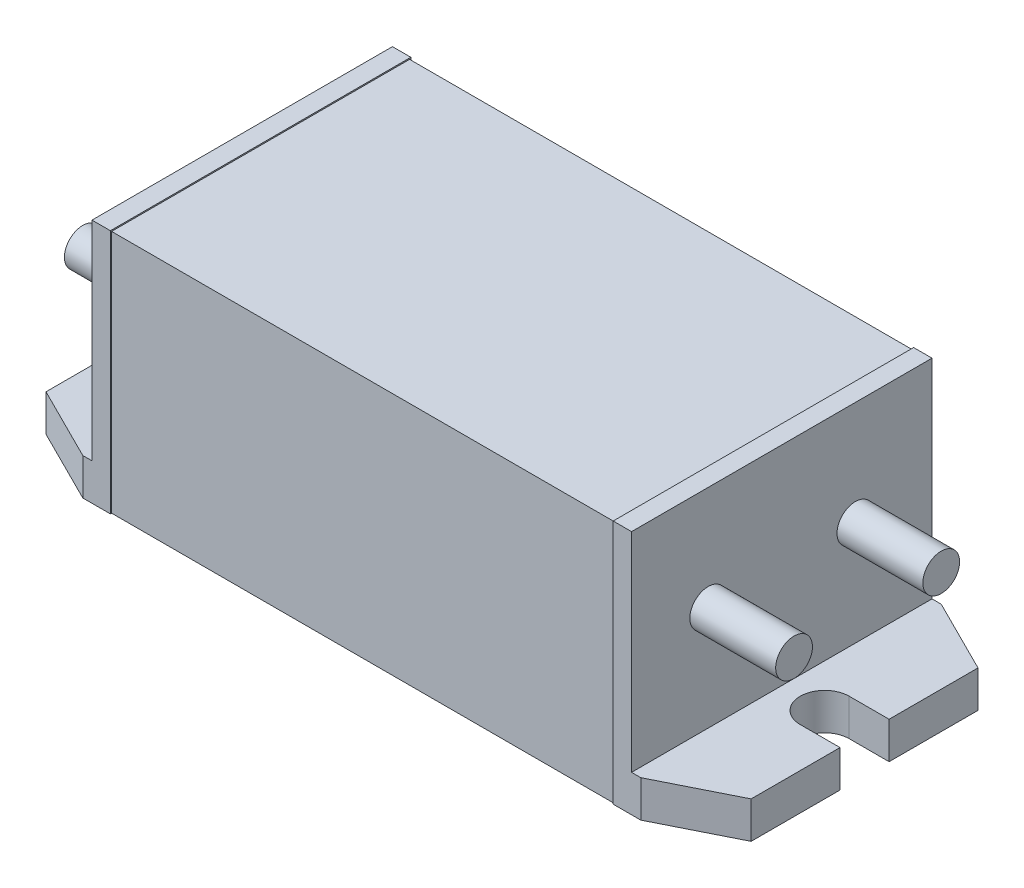
ISO-10303-21;
HEADER;
FILE_DESCRIPTION(('STEP AP214'),'2;1');
FILE_NAME('part.step','',(''),(''),'','','');
FILE_SCHEMA(('AUTOMOTIVE_DESIGN { 1 0 10303 214 1 1 1 1 }'));
ENDSEC;
DATA;
#1=APPLICATION_CONTEXT('core data for automotive mechanical design processes');
#2=APPLICATION_PROTOCOL_DEFINITION('international standard','automotive_design',2000,#1);
#3=PRODUCT_CONTEXT('',#1,'mechanical');
#4=PRODUCT('Part','Part','',(#3));
#5=PRODUCT_RELATED_PRODUCT_CATEGORY('part','',(#4));
#6=PRODUCT_DEFINITION_FORMATION('','',#4);
#7=PRODUCT_DEFINITION_CONTEXT('part definition',#1,'design');
#8=PRODUCT_DEFINITION('design','',#6,#7);
#9=PRODUCT_DEFINITION_SHAPE('','',#8);
#10=(LENGTH_UNIT() NAMED_UNIT(*) SI_UNIT(.MILLI.,.METRE.));
#11=(NAMED_UNIT(*) PLANE_ANGLE_UNIT() SI_UNIT($,.RADIAN.));
#12=(NAMED_UNIT(*) SI_UNIT($,.STERADIAN.) SOLID_ANGLE_UNIT());
#13=UNCERTAINTY_MEASURE_WITH_UNIT(LENGTH_MEASURE(1.E-05),#10,'distance_accuracy_value','');
#14=(GEOMETRIC_REPRESENTATION_CONTEXT(3) GLOBAL_UNCERTAINTY_ASSIGNED_CONTEXT((#13)) GLOBAL_UNIT_ASSIGNED_CONTEXT((#10,
#11,#12)) REPRESENTATION_CONTEXT('',''));
#15=CARTESIAN_POINT('',(0.,0.,0.));
#16=DIRECTION('',(0.,0.,1.));
#17=DIRECTION('',(1.,0.,0.));
#18=AXIS2_PLACEMENT_3D('',#15,#16,#17);
#19=CARTESIAN_POINT('',(22.,20.,12.25));
#20=DIRECTION('',(0.,0.,-1.));
#21=DIRECTION('',(-1.,0.,0.));
#22=AXIS2_PLACEMENT_3D('',#19,#20,#21);
#23=PLANE('',#22);
#24=DIRECTION('',(0.,-1.,0.));
#25=VECTOR('',#24,1.);
#26=CARTESIAN_POINT('',(20.5,3.,12.25));
#27=LINE('',#26,#25);
#28=CARTESIAN_POINT('',(20.5,20.,12.25));
#29=VERTEX_POINT('',#28);
#30=CARTESIAN_POINT('',(20.5,0.,12.25));
#31=VERTEX_POINT('',#30);
#32=EDGE_CURVE('E385',#29,#31,#27,.T.);
#33=ORIENTED_EDGE('',*,*,#32,.T.);
#34=DIRECTION('',(1.,0.,0.));
#35=VECTOR('',#34,1.);
#36=CARTESIAN_POINT('',(22.,0.,12.25));
#37=LINE('',#36,#35);
#38=CARTESIAN_POINT('',(22.75,0.,12.25));
#39=VERTEX_POINT('',#38);
#40=EDGE_CURVE('E258',#31,#39,#37,.T.);
#41=ORIENTED_EDGE('',*,*,#40,.T.);
#42=DIRECTION('',(0.,1.,0.));
#43=VECTOR('',#42,1.);
#44=CARTESIAN_POINT('',(22.75,3.,12.25));
#45=LINE('',#44,#43);
#46=CARTESIAN_POINT('',(22.75,3.,12.25));
#47=VERTEX_POINT('',#46);
#48=EDGE_CURVE('E300',#39,#47,#45,.T.);
#49=ORIENTED_EDGE('',*,*,#48,.T.);
#50=DIRECTION('',(-1.,0.,0.));
#51=VECTOR('',#50,1.);
#52=CARTESIAN_POINT('',(28.75,3.,12.25));
#53=LINE('',#52,#51);
#54=CARTESIAN_POINT('',(22.,3.,12.25));
#55=VERTEX_POINT('',#54);
#56=EDGE_CURVE('E341',#47,#55,#53,.T.);
#57=ORIENTED_EDGE('',*,*,#56,.T.);
#58=DIRECTION('',(0.,-1.,0.));
#59=VECTOR('',#58,1.);
#60=CARTESIAN_POINT('',(22.,20.,12.25));
#61=LINE('',#60,#59);
#62=CARTESIAN_POINT('',(22.,20.,12.25));
#63=VERTEX_POINT('',#62);
#64=EDGE_CURVE('E267',#63,#55,#61,.T.);
#65=ORIENTED_EDGE('',*,*,#64,.F.);
#66=DIRECTION('',(1.,0.,0.));
#67=VECTOR('',#66,1.);
#68=CARTESIAN_POINT('',(22.,20.,12.25));
#69=LINE('',#68,#67);
#70=EDGE_CURVE('E360',#29,#63,#69,.T.);
#71=ORIENTED_EDGE('',*,*,#70,.F.);
#72=EDGE_LOOP('',(#33,#41,#49,#57,#65,#71));
#73=FACE_BOUND('',#72,.T.);
#74=ADVANCED_FACE('F36',(#73),#23,.F.);
#75=CARTESIAN_POINT('',(22.,20.,-12.25));
#76=DIRECTION('',(0.,0.,1.));
#77=DIRECTION('',(1.,0.,0.));
#78=AXIS2_PLACEMENT_3D('',#75,#76,#77);
#79=PLANE('',#78);
#80=DIRECTION('',(0.,1.,0.));
#81=VECTOR('',#80,1.);
#82=CARTESIAN_POINT('',(20.5,20.,-12.25));
#83=LINE('',#82,#81);
#84=CARTESIAN_POINT('',(20.5,0.,-12.25));
#85=VERTEX_POINT('',#84);
#86=CARTESIAN_POINT('',(20.5,20.,-12.25));
#87=VERTEX_POINT('',#86);
#88=EDGE_CURVE('E379',#85,#87,#83,.T.);
#89=ORIENTED_EDGE('',*,*,#88,.T.);
#90=DIRECTION('',(-1.,0.,0.));
#91=VECTOR('',#90,1.);
#92=CARTESIAN_POINT('',(22.,20.,-12.25));
#93=LINE('',#92,#91);
#94=CARTESIAN_POINT('',(22.,20.,-12.25));
#95=VERTEX_POINT('',#94);
#96=EDGE_CURVE('E247',#95,#87,#93,.T.);
#97=ORIENTED_EDGE('',*,*,#96,.F.);
#98=DIRECTION('',(0.,-1.,0.));
#99=VECTOR('',#98,1.);
#100=CARTESIAN_POINT('',(22.,20.,-12.25));
#101=LINE('',#100,#99);
#102=CARTESIAN_POINT('',(22.,3.,-12.25));
#103=VERTEX_POINT('',#102);
#104=EDGE_CURVE('E264',#95,#103,#101,.T.);
#105=ORIENTED_EDGE('',*,*,#104,.T.);
#106=DIRECTION('',(1.,0.,0.));
#107=VECTOR('',#106,1.);
#108=CARTESIAN_POINT('',(28.75,3.,-12.25));
#109=LINE('',#108,#107);
#110=CARTESIAN_POINT('',(22.75,3.,-12.25));
#111=VERTEX_POINT('',#110);
#112=EDGE_CURVE('E481',#103,#111,#109,.T.);
#113=ORIENTED_EDGE('',*,*,#112,.T.);
#114=DIRECTION('',(0.,-1.,0.));
#115=VECTOR('',#114,1.);
#116=CARTESIAN_POINT('',(22.75,0.,-12.25));
#117=LINE('',#116,#115);
#118=CARTESIAN_POINT('',(22.75,0.,-12.25));
#119=VERTEX_POINT('',#118);
#120=EDGE_CURVE('E273',#111,#119,#117,.T.);
#121=ORIENTED_EDGE('',*,*,#120,.T.);
#122=DIRECTION('',(-1.,0.,0.));
#123=VECTOR('',#122,1.);
#124=CARTESIAN_POINT('',(22.,0.,-12.25));
#125=LINE('',#124,#123);
#126=EDGE_CURVE('E259',#119,#85,#125,.T.);
#127=ORIENTED_EDGE('',*,*,#126,.T.);
#128=EDGE_LOOP('',(#89,#97,#105,#113,#121,#127));
#129=FACE_BOUND('',#128,.T.);
#130=ADVANCED_FACE('F378',(#129),#79,.F.);
#131=CARTESIAN_POINT('',(0.,20.,0.));
#132=DIRECTION('',(0.,1.,0.));
#133=DIRECTION('',(0.,0.,1.));
#134=AXIS2_PLACEMENT_3D('',#131,#132,#133);
#135=PLANE('',#134);
#136=ORIENTED_EDGE('',*,*,#96,.T.);
#137=DIRECTION('',(0.,0.,1.));
#138=VECTOR('',#137,1.);
#139=CARTESIAN_POINT('',(20.5,20.,12.25));
#140=LINE('',#139,#138);
#141=EDGE_CURVE('E368',#87,#29,#140,.T.);
#142=ORIENTED_EDGE('',*,*,#141,.T.);
#143=ORIENTED_EDGE('',*,*,#70,.T.);
#144=DIRECTION('',(0.,0.,-1.));
#145=VECTOR('',#144,1.);
#146=CARTESIAN_POINT('',(22.,20.,12.25));
#147=LINE('',#146,#145);
#148=EDGE_CURVE('E248',#63,#95,#147,.T.);
#149=ORIENTED_EDGE('',*,*,#148,.T.);
#150=EDGE_LOOP('',(#136,#142,#143,#149));
#151=FACE_BOUND('',#150,.T.);
#152=ADVANCED_FACE('F365',(#151),#135,.T.);
#153=CARTESIAN_POINT('',(28.75,3.,-12.25));
#154=DIRECTION('',(1.,0.,0.));
#155=DIRECTION('',(0.,0.,-1.));
#156=AXIS2_PLACEMENT_3D('',#153,#154,#155);
#157=PLANE('',#156);
#158=DIRECTION('',(0.,1.,0.));
#159=VECTOR('',#158,1.);
#160=CARTESIAN_POINT('',(28.75,0.,2.));
#161=LINE('',#160,#159);
#162=CARTESIAN_POINT('',(28.75,0.,2.));
#163=VERTEX_POINT('',#162);
#164=CARTESIAN_POINT('',(28.75,3.,2.));
#165=VERTEX_POINT('',#164);
#166=EDGE_CURVE('E445',#163,#165,#161,.T.);
#167=ORIENTED_EDGE('',*,*,#166,.T.);
#168=DIRECTION('',(0.,0.,1.));
#169=VECTOR('',#168,1.);
#170=CARTESIAN_POINT('',(28.75,3.,-12.25));
#171=LINE('',#170,#169);
#172=CARTESIAN_POINT('',(28.75,3.,9.25));
#173=VERTEX_POINT('',#172);
#174=EDGE_CURVE('E345',#165,#173,#171,.T.);
#175=ORIENTED_EDGE('',*,*,#174,.T.);
#176=DIRECTION('',(0.,-1.,0.));
#177=VECTOR('',#176,1.);
#178=CARTESIAN_POINT('',(28.75,0.,9.25));
#179=LINE('',#178,#177);
#180=CARTESIAN_POINT('',(28.75,0.,9.25));
#181=VERTEX_POINT('',#180);
#182=EDGE_CURVE('E291',#173,#181,#179,.T.);
#183=ORIENTED_EDGE('',*,*,#182,.T.);
#184=DIRECTION('',(0.,0.,1.));
#185=VECTOR('',#184,1.);
#186=CARTESIAN_POINT('',(28.75,0.,-12.25));
#187=LINE('',#186,#185);
#188=EDGE_CURVE('E352',#163,#181,#187,.T.);
#189=ORIENTED_EDGE('',*,*,#188,.F.);
#190=EDGE_LOOP('',(#167,#175,#183,#189));
#191=FACE_BOUND('',#190,.T.);
#192=ADVANCED_FACE('F508',(#191),#157,.T.);
#193=CARTESIAN_POINT('',(-28.75,3.,-12.25));
#194=DIRECTION('',(-1.,0.,0.));
#195=DIRECTION('',(0.,0.,1.));
#196=AXIS2_PLACEMENT_3D('',#193,#194,#195);
#197=PLANE('',#196);
#198=DIRECTION('',(0.,1.,0.));
#199=VECTOR('',#198,1.);
#200=CARTESIAN_POINT('',(-28.75,0.,-2.));
#201=LINE('',#200,#199);
#202=CARTESIAN_POINT('',(-28.75,0.,-2.));
#203=VERTEX_POINT('',#202);
#204=CARTESIAN_POINT('',(-28.75,3.,-2.));
#205=VERTEX_POINT('',#204);
#206=EDGE_CURVE('E471',#203,#205,#201,.T.);
#207=ORIENTED_EDGE('',*,*,#206,.T.);
#208=DIRECTION('',(0.,0.,-1.));
#209=VECTOR('',#208,1.);
#210=CARTESIAN_POINT('',(-28.75,3.,-12.25));
#211=LINE('',#210,#209);
#212=CARTESIAN_POINT('',(-28.75,3.,-9.24999999999999));
#213=VERTEX_POINT('',#212);
#214=EDGE_CURVE('E357',#205,#213,#211,.T.);
#215=ORIENTED_EDGE('',*,*,#214,.T.);
#216=DIRECTION('',(0.,-1.,0.));
#217=VECTOR('',#216,1.);
#218=CARTESIAN_POINT('',(-28.75,0.,-9.24999999999999));
#219=LINE('',#218,#217);
#220=CARTESIAN_POINT('',(-28.75,0.,-9.24999999999999));
#221=VERTEX_POINT('',#220);
#222=EDGE_CURVE('E305',#213,#221,#219,.T.);
#223=ORIENTED_EDGE('',*,*,#222,.T.);
#224=DIRECTION('',(0.,0.,-1.));
#225=VECTOR('',#224,1.);
#226=CARTESIAN_POINT('',(-28.75,0.,-12.25));
#227=LINE('',#226,#225);
#228=EDGE_CURVE('E353',#203,#221,#227,.T.);
#229=ORIENTED_EDGE('',*,*,#228,.F.);
#230=EDGE_LOOP('',(#207,#215,#223,#229));
#231=FACE_BOUND('',#230,.T.);
#232=ADVANCED_FACE('F321',(#231),#197,.T.);
#233=CARTESIAN_POINT('',(-22.,20.,12.25));
#234=DIRECTION('',(1.,0.,0.));
#235=DIRECTION('',(0.,0.,-1.));
#236=AXIS2_PLACEMENT_3D('',#233,#234,#235);
#237=PLANE('',#236);
#238=CARTESIAN_POINT('',(-22.,11.5,6.));
#239=DIRECTION('',(1.,0.,0.));
#240=DIRECTION('',(0.,0.,-1.));
#241=AXIS2_PLACEMENT_3D('',#238,#239,#240);
#242=CIRCLE('',#241,1.5);
#243=CARTESIAN_POINT('',(-22.,11.5,4.5));
#244=VERTEX_POINT('',#243);
#245=EDGE_CURVE('E11',#244,#244,#242,.F.);
#246=ORIENTED_EDGE('',*,*,#245,.F.);
#247=EDGE_LOOP('',(#246));
#248=FACE_BOUND('',#247,.T.);
#249=CARTESIAN_POINT('',(-22.,11.5,-6.));
#250=DIRECTION('',(1.,0.,0.));
#251=DIRECTION('',(0.,0.,-1.));
#252=AXIS2_PLACEMENT_3D('',#249,#250,#251);
#253=CIRCLE('',#252,1.5);
#254=CARTESIAN_POINT('',(-22.,11.5,-7.5));
#255=VERTEX_POINT('',#254);
#256=EDGE_CURVE('E44',#255,#255,#253,.F.);
#257=ORIENTED_EDGE('',*,*,#256,.F.);
#258=EDGE_LOOP('',(#257));
#259=FACE_BOUND('',#258,.T.);
#260=DIRECTION('',(0.,0.,-1.));
#261=VECTOR('',#260,1.);
#262=CARTESIAN_POINT('',(-22.,3.,12.25));
#263=LINE('',#262,#261);
#264=CARTESIAN_POINT('',(-22.,3.,12.25));
#265=VERTEX_POINT('',#264);
#266=CARTESIAN_POINT('',(-22.,3.,-12.25));
#267=VERTEX_POINT('',#266);
#268=EDGE_CURVE('E326',#265,#267,#263,.T.);
#269=ORIENTED_EDGE('',*,*,#268,.F.);
#270=DIRECTION('',(0.,-1.,0.));
#271=VECTOR('',#270,1.);
#272=CARTESIAN_POINT('',(-22.,20.,12.25));
#273=LINE('',#272,#271);
#274=CARTESIAN_POINT('',(-22.,20.,12.25));
#275=VERTEX_POINT('',#274);
#276=EDGE_CURVE('E270',#275,#265,#273,.T.);
#277=ORIENTED_EDGE('',*,*,#276,.F.);
#278=DIRECTION('',(0.,0.,1.));
#279=VECTOR('',#278,1.);
#280=CARTESIAN_POINT('',(-22.,20.,12.25));
#281=LINE('',#280,#279);
#282=CARTESIAN_POINT('',(-22.,20.,-12.25));
#283=VERTEX_POINT('',#282);
#284=EDGE_CURVE('E262',#283,#275,#281,.T.);
#285=ORIENTED_EDGE('',*,*,#284,.F.);
#286=DIRECTION('',(0.,-1.,0.));
#287=VECTOR('',#286,1.);
#288=CARTESIAN_POINT('',(-22.,20.,-12.25));
#289=LINE('',#288,#287);
#290=EDGE_CURVE('E245',#283,#267,#289,.T.);
#291=ORIENTED_EDGE('',*,*,#290,.T.);
#292=EDGE_LOOP('',(#269,#277,#285,#291));
#293=FACE_BOUND('',#292,.T.);
#294=ADVANCED_FACE('F317',(#248,#259,#293),#237,.F.);
#295=CARTESIAN_POINT('',(22.,20.,12.25));
#296=DIRECTION('',(-1.,0.,0.));
#297=DIRECTION('',(0.,0.,1.));
#298=AXIS2_PLACEMENT_3D('',#295,#296,#297);
#299=PLANE('',#298);
#300=CARTESIAN_POINT('',(22.,11.5,6.));
#301=DIRECTION('',(-1.,0.,0.));
#302=DIRECTION('',(0.,0.,-1.));
#303=AXIS2_PLACEMENT_3D('',#300,#301,#302);
#304=CIRCLE('',#303,1.5);
#305=CARTESIAN_POINT('',(22.,11.5,4.5));
#306=VERTEX_POINT('',#305);
#307=EDGE_CURVE('E405',#306,#306,#304,.T.);
#308=ORIENTED_EDGE('',*,*,#307,.T.);
#309=EDGE_LOOP('',(#308));
#310=FACE_BOUND('',#309,.T.);
#311=CARTESIAN_POINT('',(22.,11.5,-6.));
#312=DIRECTION('',(-1.,0.,0.));
#313=DIRECTION('',(0.,0.,1.));
#314=AXIS2_PLACEMENT_3D('',#311,#312,#313);
#315=CIRCLE('',#314,1.5);
#316=CARTESIAN_POINT('',(22.,11.5,-4.5));
#317=VERTEX_POINT('',#316);
#318=EDGE_CURVE('E415',#317,#317,#315,.T.);
#319=ORIENTED_EDGE('',*,*,#318,.T.);
#320=EDGE_LOOP('',(#319));
#321=FACE_BOUND('',#320,.T.);
#322=DIRECTION('',(0.,0.,1.));
#323=VECTOR('',#322,1.);
#324=CARTESIAN_POINT('',(22.,3.,12.25));
#325=LINE('',#324,#323);
#326=EDGE_CURVE('E330',#103,#55,#325,.T.);
#327=ORIENTED_EDGE('',*,*,#326,.F.);
#328=ORIENTED_EDGE('',*,*,#104,.F.);
#329=ORIENTED_EDGE('',*,*,#148,.F.);
#330=ORIENTED_EDGE('',*,*,#64,.T.);
#331=EDGE_LOOP('',(#327,#328,#329,#330));
#332=FACE_BOUND('',#331,.T.);
#333=ADVANCED_FACE('F320',(#310,#321,#332),#299,.F.);
#334=CARTESIAN_POINT('',(-22.75,0.,12.25));
#335=VERTEX_POINT('',#334);
#336=CARTESIAN_POINT('',(-20.5,0.,12.25));
#337=VERTEX_POINT('',#336);
#338=EDGE_CURVE('E254',#335,#337,#37,.T.);
#339=ORIENTED_EDGE('',*,*,#338,.T.);
#340=DIRECTION('',(0.,-1.,0.));
#341=VECTOR('',#340,1.);
#342=CARTESIAN_POINT('',(-20.5,20.,12.25));
#343=LINE('',#342,#341);
#344=CARTESIAN_POINT('',(-20.5,20.,12.25));
#345=VERTEX_POINT('',#344);
#346=EDGE_CURVE('E241',#345,#337,#343,.T.);
#347=ORIENTED_EDGE('',*,*,#346,.F.);
#348=EDGE_CURVE('E240',#275,#345,#69,.T.);
#349=ORIENTED_EDGE('',*,*,#348,.F.);
#350=ORIENTED_EDGE('',*,*,#276,.T.);
#351=CARTESIAN_POINT('',(-22.75,3.,12.25));
#352=VERTEX_POINT('',#351);
#353=EDGE_CURVE('E335',#265,#352,#53,.T.);
#354=ORIENTED_EDGE('',*,*,#353,.T.);
#355=DIRECTION('',(0.,-1.,0.));
#356=VECTOR('',#355,1.);
#357=CARTESIAN_POINT('',(-22.75,0.,12.25));
#358=LINE('',#357,#356);
#359=EDGE_CURVE('E284',#352,#335,#358,.T.);
#360=ORIENTED_EDGE('',*,*,#359,.T.);
#361=EDGE_LOOP('',(#339,#347,#349,#350,#354,#360));
#362=FACE_BOUND('',#361,.T.);
#363=ADVANCED_FACE('F334',(#362),#23,.F.);
#364=CARTESIAN_POINT('',(-20.5,20.,-12.25));
#365=VERTEX_POINT('',#364);
#366=EDGE_CURVE('E238',#365,#283,#93,.T.);
#367=ORIENTED_EDGE('',*,*,#366,.F.);
#368=DIRECTION('',(0.,1.,0.));
#369=VECTOR('',#368,1.);
#370=CARTESIAN_POINT('',(-20.5,0.,-12.25));
#371=LINE('',#370,#369);
#372=CARTESIAN_POINT('',(-20.5,0.,-12.25));
#373=VERTEX_POINT('',#372);
#374=EDGE_CURVE('E222',#373,#365,#371,.T.);
#375=ORIENTED_EDGE('',*,*,#374,.F.);
#376=CARTESIAN_POINT('',(-22.75,0.,-12.25));
#377=VERTEX_POINT('',#376);
#378=EDGE_CURVE('E257',#373,#377,#125,.T.);
#379=ORIENTED_EDGE('',*,*,#378,.T.);
#380=DIRECTION('',(0.,1.,0.));
#381=VECTOR('',#380,1.);
#382=CARTESIAN_POINT('',(-22.75,3.,-12.25));
#383=LINE('',#382,#381);
#384=CARTESIAN_POINT('',(-22.75,3.,-12.25));
#385=VERTEX_POINT('',#384);
#386=EDGE_CURVE('E308',#377,#385,#383,.T.);
#387=ORIENTED_EDGE('',*,*,#386,.T.);
#388=EDGE_CURVE('E482',#385,#267,#109,.T.);
#389=ORIENTED_EDGE('',*,*,#388,.T.);
#390=ORIENTED_EDGE('',*,*,#290,.F.);
#391=EDGE_LOOP('',(#367,#375,#379,#387,#389,#390));
#392=FACE_BOUND('',#391,.T.);
#393=ADVANCED_FACE('F243',(#392),#79,.F.);
#394=DIRECTION('',(0.,0.,1.));
#395=VECTOR('',#394,1.);
#396=CARTESIAN_POINT('',(-20.5,20.,12.25));
#397=LINE('',#396,#395);
#398=EDGE_CURVE('E225',#365,#345,#397,.T.);
#399=ORIENTED_EDGE('',*,*,#398,.F.);
#400=ORIENTED_EDGE('',*,*,#366,.T.);
#401=ORIENTED_EDGE('',*,*,#284,.T.);
#402=ORIENTED_EDGE('',*,*,#348,.T.);
#403=EDGE_LOOP('',(#399,#400,#401,#402));
#404=FACE_BOUND('',#403,.T.);
#405=ADVANCED_FACE('F236',(#404),#135,.T.);
#406=CARTESIAN_POINT('',(0.,0.,0.));
#407=DIRECTION('',(0.,1.,0.));
#408=DIRECTION('',(0.,0.,1.));
#409=AXIS2_PLACEMENT_3D('',#406,#407,#408);
#410=PLANE('',#409);
#411=ORIENTED_EDGE('',*,*,#378,.F.);
#412=DIRECTION('',(0.,0.,-1.));
#413=VECTOR('',#412,1.);
#414=CARTESIAN_POINT('',(-20.5,0.,-12.15));
#415=LINE('',#414,#413);
#416=CARTESIAN_POINT('',(-20.5,0.,-12.15));
#417=VERTEX_POINT('',#416);
#418=EDGE_CURVE('E228',#417,#373,#415,.T.);
#419=ORIENTED_EDGE('',*,*,#418,.F.);
#420=DIRECTION('',(1.,0.,0.));
#421=VECTOR('',#420,1.);
#422=CARTESIAN_POINT('',(-20.5,0.,-12.15));
#423=LINE('',#422,#421);
#424=CARTESIAN_POINT('',(20.5,0.,-12.15));
#425=VERTEX_POINT('',#424);
#426=EDGE_CURVE('E402',#417,#425,#423,.T.);
#427=ORIENTED_EDGE('',*,*,#426,.T.);
#428=DIRECTION('',(0.,0.,-1.));
#429=VECTOR('',#428,1.);
#430=CARTESIAN_POINT('',(20.5,0.,-12.15));
#431=LINE('',#430,#429);
#432=EDGE_CURVE('E232',#425,#85,#431,.T.);
#433=ORIENTED_EDGE('',*,*,#432,.T.);
#434=ORIENTED_EDGE('',*,*,#126,.F.);
#435=DIRECTION('',(0.894427190999917,0.,0.447213595499956));
#436=VECTOR('',#435,1.);
#437=CARTESIAN_POINT('',(22.75,0.,-12.25));
#438=LINE('',#437,#436);
#439=CARTESIAN_POINT('',(28.75,0.,-9.25));
#440=VERTEX_POINT('',#439);
#441=EDGE_CURVE('E278',#119,#440,#438,.T.);
#442=ORIENTED_EDGE('',*,*,#441,.T.);
#443=CARTESIAN_POINT('',(28.75,0.,-2.));
#444=VERTEX_POINT('',#443);
#445=EDGE_CURVE('E354',#440,#444,#187,.T.);
#446=ORIENTED_EDGE('',*,*,#445,.T.);
#447=DIRECTION('',(-1.,0.,0.));
#448=VECTOR('',#447,1.);
#449=CARTESIAN_POINT('',(25.5,0.,-2.));
#450=LINE('',#449,#448);
#451=CARTESIAN_POINT('',(25.5,0.,-2.));
#452=VERTEX_POINT('',#451);
#453=EDGE_CURVE('E430',#444,#452,#450,.T.);
#454=ORIENTED_EDGE('',*,*,#453,.T.);
#455=CARTESIAN_POINT('',(25.5,0.,0.));
#456=DIRECTION('',(0.,1.,0.));
#457=DIRECTION('',(0.,0.,-1.));
#458=AXIS2_PLACEMENT_3D('',#455,#456,#457);
#459=CIRCLE('',#458,2.);
#460=CARTESIAN_POINT('',(25.5,0.,2.));
#461=VERTEX_POINT('',#460);
#462=EDGE_CURVE('E433',#452,#461,#459,.T.);
#463=ORIENTED_EDGE('',*,*,#462,.T.);
#464=DIRECTION('',(1.,0.,0.));
#465=VECTOR('',#464,1.);
#466=CARTESIAN_POINT('',(28.75,0.,2.));
#467=LINE('',#466,#465);
#468=EDGE_CURVE('E437',#461,#163,#467,.T.);
#469=ORIENTED_EDGE('',*,*,#468,.T.);
#470=ORIENTED_EDGE('',*,*,#188,.T.);
#471=DIRECTION('',(-0.894427190999917,0.,0.447213595499956));
#472=VECTOR('',#471,1.);
#473=CARTESIAN_POINT('',(28.75,0.,9.25));
#474=LINE('',#473,#472);
#475=EDGE_CURVE('E297',#181,#39,#474,.T.);
#476=ORIENTED_EDGE('',*,*,#475,.T.);
#477=ORIENTED_EDGE('',*,*,#40,.F.);
#478=DIRECTION('',(0.,0.,-1.));
#479=VECTOR('',#478,1.);
#480=CARTESIAN_POINT('',(20.5,0.,12.25));
#481=LINE('',#480,#479);
#482=CARTESIAN_POINT('',(20.5,0.,12.15));
#483=VERTEX_POINT('',#482);
#484=EDGE_CURVE('E391',#31,#483,#481,.T.);
#485=ORIENTED_EDGE('',*,*,#484,.T.);
#486=DIRECTION('',(1.,0.,0.));
#487=VECTOR('',#486,1.);
#488=CARTESIAN_POINT('',(-20.5,0.,12.15));
#489=LINE('',#488,#487);
#490=CARTESIAN_POINT('',(-20.5,0.,12.15));
#491=VERTEX_POINT('',#490);
#492=EDGE_CURVE('E51',#491,#483,#489,.T.);
#493=ORIENTED_EDGE('',*,*,#492,.F.);
#494=DIRECTION('',(0.,0.,-1.));
#495=VECTOR('',#494,1.);
#496=CARTESIAN_POINT('',(-20.5,0.,12.25));
#497=LINE('',#496,#495);
#498=EDGE_CURVE('E529',#337,#491,#497,.T.);
#499=ORIENTED_EDGE('',*,*,#498,.F.);
#500=ORIENTED_EDGE('',*,*,#338,.F.);
#501=DIRECTION('',(-0.894427190999917,0.,-0.447213595499956));
#502=VECTOR('',#501,1.);
#503=CARTESIAN_POINT('',(-22.75,0.,12.25));
#504=LINE('',#503,#502);
#505=CARTESIAN_POINT('',(-28.75,0.,9.25000000000001));
#506=VERTEX_POINT('',#505);
#507=EDGE_CURVE('E276',#335,#506,#504,.T.);
#508=ORIENTED_EDGE('',*,*,#507,.T.);
#509=CARTESIAN_POINT('',(-28.75,0.,2.));
#510=VERTEX_POINT('',#509);
#511=EDGE_CURVE('E349',#506,#510,#227,.T.);
#512=ORIENTED_EDGE('',*,*,#511,.T.);
#513=DIRECTION('',(1.,0.,0.));
#514=VECTOR('',#513,1.);
#515=CARTESIAN_POINT('',(-28.75,0.,2.));
#516=LINE('',#515,#514);
#517=CARTESIAN_POINT('',(-25.5,0.,2.));
#518=VERTEX_POINT('',#517);
#519=EDGE_CURVE('E454',#510,#518,#516,.T.);
#520=ORIENTED_EDGE('',*,*,#519,.T.);
#521=CARTESIAN_POINT('',(-25.5,0.,0.));
#522=DIRECTION('',(0.,1.,0.));
#523=DIRECTION('',(0.,0.,1.));
#524=AXIS2_PLACEMENT_3D('',#521,#522,#523);
#525=CIRCLE('',#524,2.);
#526=CARTESIAN_POINT('',(-25.5,0.,-2.));
#527=VERTEX_POINT('',#526);
#528=EDGE_CURVE('E457',#518,#527,#525,.T.);
#529=ORIENTED_EDGE('',*,*,#528,.T.);
#530=DIRECTION('',(-1.,0.,0.));
#531=VECTOR('',#530,1.);
#532=CARTESIAN_POINT('',(-25.5,0.,-2.));
#533=LINE('',#532,#531);
#534=EDGE_CURVE('E461',#527,#203,#533,.T.);
#535=ORIENTED_EDGE('',*,*,#534,.T.);
#536=ORIENTED_EDGE('',*,*,#228,.T.);
#537=DIRECTION('',(0.894427190999917,0.,-0.447213595499957));
#538=VECTOR('',#537,1.);
#539=CARTESIAN_POINT('',(-28.75,0.,-9.24999999999999));
#540=LINE('',#539,#538);
#541=EDGE_CURVE('E294',#221,#377,#540,.T.);
#542=ORIENTED_EDGE('',*,*,#541,.T.);
#543=EDGE_LOOP('',(#411,#419,#427,#433,#434,#442,#446,#454,#463,#469,#470,#476,#477,#485,#493,
#499,#500,#508,#512,#520,#529,#535,#536,#542));
#544=FACE_BOUND('',#543,.T.);
#545=ADVANCED_FACE('F491',(#544),#410,.F.);
#546=DIRECTION('',(0.,1.,0.));
#547=VECTOR('',#546,1.);
#548=CARTESIAN_POINT('',(28.75,0.,-2.));
#549=LINE('',#548,#547);
#550=CARTESIAN_POINT('',(28.75,3.,-2.));
#551=VERTEX_POINT('',#550);
#552=EDGE_CURVE('E59',#444,#551,#549,.T.);
#553=ORIENTED_EDGE('',*,*,#552,.F.);
#554=ORIENTED_EDGE('',*,*,#445,.F.);
#555=DIRECTION('',(0.,1.,0.));
#556=VECTOR('',#555,1.);
#557=CARTESIAN_POINT('',(28.75,3.,-9.25));
#558=LINE('',#557,#556);
#559=CARTESIAN_POINT('',(28.75,3.,-9.25));
#560=VERTEX_POINT('',#559);
#561=EDGE_CURVE('E280',#440,#560,#558,.T.);
#562=ORIENTED_EDGE('',*,*,#561,.T.);
#563=EDGE_CURVE('E342',#560,#551,#171,.T.);
#564=ORIENTED_EDGE('',*,*,#563,.T.);
#565=EDGE_LOOP('',(#553,#554,#562,#564));
#566=FACE_BOUND('',#565,.T.);
#567=ADVANCED_FACE('F493',(#566),#157,.T.);
#568=CARTESIAN_POINT('',(0.,3.,0.));
#569=DIRECTION('',(0.,-1.,0.));
#570=DIRECTION('',(0.,0.,-1.));
#571=AXIS2_PLACEMENT_3D('',#568,#569,#570);
#572=PLANE('',#571);
#573=ORIENTED_EDGE('',*,*,#174,.F.);
#574=DIRECTION('',(1.,0.,0.));
#575=VECTOR('',#574,1.);
#576=CARTESIAN_POINT('',(28.75,3.,2.));
#577=LINE('',#576,#575);
#578=CARTESIAN_POINT('',(25.5,3.,2.));
#579=VERTEX_POINT('',#578);
#580=EDGE_CURVE('E434',#579,#165,#577,.T.);
#581=ORIENTED_EDGE('',*,*,#580,.F.);
#582=CARTESIAN_POINT('',(25.5,3.,0.));
#583=DIRECTION('',(0.,1.,0.));
#584=DIRECTION('',(0.,0.,-1.));
#585=AXIS2_PLACEMENT_3D('',#582,#583,#584);
#586=CIRCLE('',#585,2.);
#587=CARTESIAN_POINT('',(25.5,3.,-2.));
#588=VERTEX_POINT('',#587);
#589=EDGE_CURVE('E441',#588,#579,#586,.T.);
#590=ORIENTED_EDGE('',*,*,#589,.F.);
#591=DIRECTION('',(-1.,0.,0.));
#592=VECTOR('',#591,1.);
#593=CARTESIAN_POINT('',(25.5,3.,-2.));
#594=LINE('',#593,#592);
#595=EDGE_CURVE('E429',#551,#588,#594,.T.);
#596=ORIENTED_EDGE('',*,*,#595,.F.);
#597=ORIENTED_EDGE('',*,*,#563,.F.);
#598=DIRECTION('',(-0.894427190999917,0.,-0.447213595499956));
#599=VECTOR('',#598,1.);
#600=CARTESIAN_POINT('',(22.75,3.,-12.25));
#601=LINE('',#600,#599);
#602=EDGE_CURVE('E282',#560,#111,#601,.T.);
#603=ORIENTED_EDGE('',*,*,#602,.T.);
#604=ORIENTED_EDGE('',*,*,#112,.F.);
#605=ORIENTED_EDGE('',*,*,#326,.T.);
#606=ORIENTED_EDGE('',*,*,#56,.F.);
#607=DIRECTION('',(0.894427190999917,0.,-0.447213595499956));
#608=VECTOR('',#607,1.);
#609=CARTESIAN_POINT('',(28.75,3.,9.25));
#610=LINE('',#609,#608);
#611=EDGE_CURVE('E302',#47,#173,#610,.T.);
#612=ORIENTED_EDGE('',*,*,#611,.T.);
#613=EDGE_LOOP('',(#573,#581,#590,#596,#597,#603,#604,#605,#606,#612));
#614=FACE_BOUND('',#613,.T.);
#615=ADVANCED_FACE('F496',(#614),#572,.F.);
#616=ORIENTED_EDGE('',*,*,#214,.F.);
#617=DIRECTION('',(-1.,0.,0.));
#618=VECTOR('',#617,1.);
#619=CARTESIAN_POINT('',(-25.5,3.,-2.));
#620=LINE('',#619,#618);
#621=CARTESIAN_POINT('',(-25.5,3.,-2.));
#622=VERTEX_POINT('',#621);
#623=EDGE_CURVE('E458',#622,#205,#620,.T.);
#624=ORIENTED_EDGE('',*,*,#623,.F.);
#625=CARTESIAN_POINT('',(-25.5,3.,0.));
#626=DIRECTION('',(0.,1.,0.));
#627=DIRECTION('',(0.,0.,1.));
#628=AXIS2_PLACEMENT_3D('',#625,#626,#627);
#629=CIRCLE('',#628,2.);
#630=CARTESIAN_POINT('',(-25.5,3.,2.));
#631=VERTEX_POINT('',#630);
#632=EDGE_CURVE('E467',#631,#622,#629,.T.);
#633=ORIENTED_EDGE('',*,*,#632,.F.);
#634=DIRECTION('',(1.,0.,0.));
#635=VECTOR('',#634,1.);
#636=CARTESIAN_POINT('',(-28.75,3.,2.));
#637=LINE('',#636,#635);
#638=CARTESIAN_POINT('',(-28.75,3.,2.));
#639=VERTEX_POINT('',#638);
#640=EDGE_CURVE('E448',#639,#631,#637,.T.);
#641=ORIENTED_EDGE('',*,*,#640,.F.);
#642=CARTESIAN_POINT('',(-28.75,3.,9.25000000000001));
#643=VERTEX_POINT('',#642);
#644=EDGE_CURVE('E479',#643,#639,#211,.T.);
#645=ORIENTED_EDGE('',*,*,#644,.F.);
#646=DIRECTION('',(0.894427190999917,0.,0.447213595499956));
#647=VECTOR('',#646,1.);
#648=CARTESIAN_POINT('',(-22.75,3.,12.25));
#649=LINE('',#648,#647);
#650=EDGE_CURVE('E289',#643,#352,#649,.T.);
#651=ORIENTED_EDGE('',*,*,#650,.T.);
#652=ORIENTED_EDGE('',*,*,#353,.F.);
#653=ORIENTED_EDGE('',*,*,#268,.T.);
#654=ORIENTED_EDGE('',*,*,#388,.F.);
#655=DIRECTION('',(-0.894427190999917,0.,0.447213595499957));
#656=VECTOR('',#655,1.);
#657=CARTESIAN_POINT('',(-28.75,3.,-9.24999999999999));
#658=LINE('',#657,#656);
#659=EDGE_CURVE('E310',#385,#213,#658,.T.);
#660=ORIENTED_EDGE('',*,*,#659,.T.);
#661=EDGE_LOOP('',(#616,#624,#633,#641,#645,#651,#652,#653,#654,#660));
#662=FACE_BOUND('',#661,.T.);
#663=ADVANCED_FACE('F338',(#662),#572,.F.);
#664=DIRECTION('',(0.,1.,0.));
#665=VECTOR('',#664,1.);
#666=CARTESIAN_POINT('',(-28.75,0.,2.));
#667=LINE('',#666,#665);
#668=EDGE_CURVE('E464',#510,#639,#667,.T.);
#669=ORIENTED_EDGE('',*,*,#668,.F.);
#670=ORIENTED_EDGE('',*,*,#511,.F.);
#671=DIRECTION('',(0.,1.,0.));
#672=VECTOR('',#671,1.);
#673=CARTESIAN_POINT('',(-28.75,3.,9.25000000000001));
#674=LINE('',#673,#672);
#675=EDGE_CURVE('E287',#506,#643,#674,.T.);
#676=ORIENTED_EDGE('',*,*,#675,.T.);
#677=ORIENTED_EDGE('',*,*,#644,.T.);
#678=EDGE_LOOP('',(#669,#670,#676,#677));
#679=FACE_BOUND('',#678,.T.);
#680=ADVANCED_FACE('F541',(#679),#197,.T.);
#681=CARTESIAN_POINT('',(22.75,20.,-12.25));
#682=DIRECTION('',(0.447213595499956,0.,-0.894427190999917));
#683=DIRECTION('',(0.,1.,0.));
#684=AXIS2_PLACEMENT_3D('',#681,#682,#683);
#685=PLANE('',#684);
#686=ORIENTED_EDGE('',*,*,#602,.F.);
#687=ORIENTED_EDGE('',*,*,#561,.F.);
#688=ORIENTED_EDGE('',*,*,#441,.F.);
#689=ORIENTED_EDGE('',*,*,#120,.F.);
#690=EDGE_LOOP('',(#686,#687,#688,#689));
#691=FACE_BOUND('',#690,.T.);
#692=ADVANCED_FACE('F487',(#691),#685,.T.);
#693=CARTESIAN_POINT('',(-22.75,20.,12.25));
#694=DIRECTION('',(-0.447213595499956,0.,0.894427190999917));
#695=DIRECTION('',(0.,1.,0.));
#696=AXIS2_PLACEMENT_3D('',#693,#694,#695);
#697=PLANE('',#696);
#698=ORIENTED_EDGE('',*,*,#650,.F.);
#699=ORIENTED_EDGE('',*,*,#675,.F.);
#700=ORIENTED_EDGE('',*,*,#507,.F.);
#701=ORIENTED_EDGE('',*,*,#359,.F.);
#702=EDGE_LOOP('',(#698,#699,#700,#701));
#703=FACE_BOUND('',#702,.T.);
#704=ADVANCED_FACE('F536',(#703),#697,.T.);
#705=CARTESIAN_POINT('',(28.75,3.,9.25));
#706=DIRECTION('',(0.447213595499956,0.,0.894427190999917));
#707=DIRECTION('',(0.,1.,0.));
#708=AXIS2_PLACEMENT_3D('',#705,#706,#707);
#709=PLANE('',#708);
#710=ORIENTED_EDGE('',*,*,#611,.F.);
#711=ORIENTED_EDGE('',*,*,#48,.F.);
#712=ORIENTED_EDGE('',*,*,#475,.F.);
#713=ORIENTED_EDGE('',*,*,#182,.F.);
#714=EDGE_LOOP('',(#710,#711,#712,#713));
#715=FACE_BOUND('',#714,.T.);
#716=ADVANCED_FACE('F512',(#715),#709,.T.);
#717=CARTESIAN_POINT('',(-28.75,3.,-9.24999999999999));
#718=DIRECTION('',(-0.447213595499957,0.,-0.894427190999917));
#719=DIRECTION('',(0.,1.,0.));
#720=AXIS2_PLACEMENT_3D('',#717,#718,#719);
#721=PLANE('',#720);
#722=ORIENTED_EDGE('',*,*,#659,.F.);
#723=ORIENTED_EDGE('',*,*,#386,.F.);
#724=ORIENTED_EDGE('',*,*,#541,.F.);
#725=ORIENTED_EDGE('',*,*,#222,.F.);
#726=EDGE_LOOP('',(#722,#723,#724,#725));
#727=FACE_BOUND('',#726,.T.);
#728=ADVANCED_FACE('F38',(#727),#721,.T.);
#729=CARTESIAN_POINT('',(-25.5,0.,-2.));
#730=DIRECTION('',(0.,0.,-1.));
#731=DIRECTION('',(-1.,0.,0.));
#732=AXIS2_PLACEMENT_3D('',#729,#730,#731);
#733=PLANE('',#732);
#734=ORIENTED_EDGE('',*,*,#623,.T.);
#735=ORIENTED_EDGE('',*,*,#206,.F.);
#736=ORIENTED_EDGE('',*,*,#534,.F.);
#737=DIRECTION('',(0.,1.,0.));
#738=VECTOR('',#737,1.);
#739=CARTESIAN_POINT('',(-25.5,0.,-2.));
#740=LINE('',#739,#738);
#741=EDGE_CURVE('E474',#527,#622,#740,.T.);
#742=ORIENTED_EDGE('',*,*,#741,.T.);
#743=EDGE_LOOP('',(#734,#735,#736,#742));
#744=FACE_BOUND('',#743,.T.);
#745=ADVANCED_FACE('F606',(#744),#733,.F.);
#746=CARTESIAN_POINT('',(-25.5,0.,0.));
#747=DIRECTION('',(0.,1.,0.));
#748=DIRECTION('',(0.,0.,1.));
#749=AXIS2_PLACEMENT_3D('',#746,#747,#748);
#750=CYLINDRICAL_SURFACE('',#749,2.);
#751=ORIENTED_EDGE('',*,*,#632,.T.);
#752=ORIENTED_EDGE('',*,*,#741,.F.);
#753=ORIENTED_EDGE('',*,*,#528,.F.);
#754=DIRECTION('',(0.,1.,0.));
#755=VECTOR('',#754,1.);
#756=CARTESIAN_POINT('',(-25.5,0.,2.));
#757=LINE('',#756,#755);
#758=EDGE_CURVE('E476',#518,#631,#757,.T.);
#759=ORIENTED_EDGE('',*,*,#758,.T.);
#760=EDGE_LOOP('',(#751,#752,#753,#759));
#761=FACE_BOUND('',#760,.T.);
#762=ADVANCED_FACE('F548',(#761),#750,.F.);
#763=CARTESIAN_POINT('',(-28.75,0.,2.));
#764=DIRECTION('',(0.,0.,1.));
#765=DIRECTION('',(1.,0.,0.));
#766=AXIS2_PLACEMENT_3D('',#763,#764,#765);
#767=PLANE('',#766);
#768=ORIENTED_EDGE('',*,*,#640,.T.);
#769=ORIENTED_EDGE('',*,*,#758,.F.);
#770=ORIENTED_EDGE('',*,*,#519,.F.);
#771=ORIENTED_EDGE('',*,*,#668,.T.);
#772=EDGE_LOOP('',(#768,#769,#770,#771));
#773=FACE_BOUND('',#772,.T.);
#774=ADVANCED_FACE('F544',(#773),#767,.F.);
#775=CARTESIAN_POINT('',(28.75,0.,2.));
#776=DIRECTION('',(0.,0.,1.));
#777=DIRECTION('',(1.,0.,0.));
#778=AXIS2_PLACEMENT_3D('',#775,#776,#777);
#779=PLANE('',#778);
#780=ORIENTED_EDGE('',*,*,#580,.T.);
#781=ORIENTED_EDGE('',*,*,#166,.F.);
#782=ORIENTED_EDGE('',*,*,#468,.F.);
#783=DIRECTION('',(0.,1.,0.));
#784=VECTOR('',#783,1.);
#785=CARTESIAN_POINT('',(25.5,0.,2.));
#786=LINE('',#785,#784);
#787=EDGE_CURVE('E449',#461,#579,#786,.T.);
#788=ORIENTED_EDGE('',*,*,#787,.T.);
#789=EDGE_LOOP('',(#780,#781,#782,#788));
#790=FACE_BOUND('',#789,.T.);
#791=ADVANCED_FACE('F603',(#790),#779,.F.);
#792=CARTESIAN_POINT('',(25.5,0.,0.));
#793=DIRECTION('',(0.,1.,0.));
#794=DIRECTION('',(0.,0.,1.));
#795=AXIS2_PLACEMENT_3D('',#792,#793,#794);
#796=CYLINDRICAL_SURFACE('',#795,2.);
#797=ORIENTED_EDGE('',*,*,#589,.T.);
#798=ORIENTED_EDGE('',*,*,#787,.F.);
#799=ORIENTED_EDGE('',*,*,#462,.F.);
#800=DIRECTION('',(0.,1.,0.));
#801=VECTOR('',#800,1.);
#802=CARTESIAN_POINT('',(25.5,0.,-2.));
#803=LINE('',#802,#801);
#804=EDGE_CURVE('E451',#452,#588,#803,.T.);
#805=ORIENTED_EDGE('',*,*,#804,.T.);
#806=EDGE_LOOP('',(#797,#798,#799,#805));
#807=FACE_BOUND('',#806,.T.);
#808=ADVANCED_FACE('F502',(#807),#796,.F.);
#809=CARTESIAN_POINT('',(25.5,0.,-2.));
#810=DIRECTION('',(0.,0.,-1.));
#811=DIRECTION('',(-1.,0.,0.));
#812=AXIS2_PLACEMENT_3D('',#809,#810,#811);
#813=PLANE('',#812);
#814=ORIENTED_EDGE('',*,*,#595,.T.);
#815=ORIENTED_EDGE('',*,*,#804,.F.);
#816=ORIENTED_EDGE('',*,*,#453,.F.);
#817=ORIENTED_EDGE('',*,*,#552,.T.);
#818=EDGE_LOOP('',(#814,#815,#816,#817));
#819=FACE_BOUND('',#818,.T.);
#820=ADVANCED_FACE('F499',(#819),#813,.F.);
#821=CARTESIAN_POINT('',(-29.,11.5,-6.));
#822=DIRECTION('',(1.,0.,0.));
#823=DIRECTION('',(0.,0.,-1.));
#824=AXIS2_PLACEMENT_3D('',#821,#822,#823);
#825=CYLINDRICAL_SURFACE('',#824,1.5);
#826=CARTESIAN_POINT('',(-29.,11.5,-6.));
#827=DIRECTION('',(-1.,0.,0.));
#828=DIRECTION('',(0.,0.,1.));
#829=AXIS2_PLACEMENT_3D('',#826,#827,#828);
#830=CIRCLE('',#829,1.5);
#831=CARTESIAN_POINT('',(-29.,11.5,-4.5));
#832=VERTEX_POINT('',#831);
#833=EDGE_CURVE('E426',#832,#832,#830,.T.);
#834=ORIENTED_EDGE('',*,*,#833,.F.);
#835=EDGE_LOOP('',(#834));
#836=FACE_BOUND('',#835,.T.);
#837=ORIENTED_EDGE('',*,*,#256,.T.);
#838=EDGE_LOOP('',(#837));
#839=FACE_BOUND('',#838,.T.);
#840=ADVANCED_FACE('F315',(#836,#839),#825,.T.);
#841=CARTESIAN_POINT('',(-29.,11.5,-6.));
#842=DIRECTION('',(-1.,0.,0.));
#843=DIRECTION('',(0.,0.,1.));
#844=AXIS2_PLACEMENT_3D('',#841,#842,#843);
#845=PLANE('',#844);
#846=ORIENTED_EDGE('',*,*,#833,.T.);
#847=EDGE_LOOP('',(#846));
#848=FACE_BOUND('',#847,.T.);
#849=ADVANCED_FACE('F617',(#848),#845,.T.);
#850=CARTESIAN_POINT('',(-29.,11.5,6.));
#851=DIRECTION('',(1.,0.,0.));
#852=DIRECTION('',(0.,0.,-1.));
#853=AXIS2_PLACEMENT_3D('',#850,#851,#852);
#854=CYLINDRICAL_SURFACE('',#853,1.5);
#855=CARTESIAN_POINT('',(-29.,11.5,6.));
#856=DIRECTION('',(-1.,0.,0.));
#857=DIRECTION('',(0.,0.,-1.));
#858=AXIS2_PLACEMENT_3D('',#855,#856,#857);
#859=CIRCLE('',#858,1.5);
#860=CARTESIAN_POINT('',(-29.,11.5,4.5));
#861=VERTEX_POINT('',#860);
#862=EDGE_CURVE('E421',#861,#861,#859,.T.);
#863=ORIENTED_EDGE('',*,*,#862,.F.);
#864=EDGE_LOOP('',(#863));
#865=FACE_BOUND('',#864,.T.);
#866=ORIENTED_EDGE('',*,*,#245,.T.);
#867=EDGE_LOOP('',(#866));
#868=FACE_BOUND('',#867,.T.);
#869=ADVANCED_FACE('F621',(#865,#868),#854,.T.);
#870=CARTESIAN_POINT('',(-29.,11.5,6.));
#871=DIRECTION('',(1.,0.,0.));
#872=DIRECTION('',(0.,0.,-1.));
#873=AXIS2_PLACEMENT_3D('',#870,#871,#872);
#874=PLANE('',#873);
#875=ORIENTED_EDGE('',*,*,#862,.T.);
#876=EDGE_LOOP('',(#875));
#877=FACE_BOUND('',#876,.T.);
#878=ADVANCED_FACE('F625',(#877),#874,.F.);
#879=CARTESIAN_POINT('',(29.,11.5,-6.));
#880=DIRECTION('',(-1.,0.,0.));
#881=DIRECTION('',(0.,0.,1.));
#882=AXIS2_PLACEMENT_3D('',#879,#880,#881);
#883=CYLINDRICAL_SURFACE('',#882,1.5);
#884=CARTESIAN_POINT('',(29.,11.5,-6.));
#885=DIRECTION('',(-1.,0.,0.));
#886=DIRECTION('',(0.,0.,1.));
#887=AXIS2_PLACEMENT_3D('',#884,#885,#886);
#888=CIRCLE('',#887,1.5);
#889=CARTESIAN_POINT('',(29.,11.5,-4.5));
#890=VERTEX_POINT('',#889);
#891=EDGE_CURVE('E418',#890,#890,#888,.T.);
#892=ORIENTED_EDGE('',*,*,#891,.T.);
#893=EDGE_LOOP('',(#892));
#894=FACE_BOUND('',#893,.T.);
#895=ORIENTED_EDGE('',*,*,#318,.F.);
#896=EDGE_LOOP('',(#895));
#897=FACE_BOUND('',#896,.T.);
#898=ADVANCED_FACE('F629',(#894,#897),#883,.T.);
#899=CARTESIAN_POINT('',(29.,11.5,-6.));
#900=DIRECTION('',(1.,0.,0.));
#901=DIRECTION('',(0.,0.,1.));
#902=AXIS2_PLACEMENT_3D('',#899,#900,#901);
#903=PLANE('',#902);
#904=ORIENTED_EDGE('',*,*,#891,.F.);
#905=EDGE_LOOP('',(#904));
#906=FACE_BOUND('',#905,.T.);
#907=ADVANCED_FACE('F633',(#906),#903,.T.);
#908=CARTESIAN_POINT('',(29.,11.5,6.));
#909=DIRECTION('',(-1.,0.,0.));
#910=DIRECTION('',(0.,0.,1.));
#911=AXIS2_PLACEMENT_3D('',#908,#909,#910);
#912=CYLINDRICAL_SURFACE('',#911,1.5);
#913=CARTESIAN_POINT('',(29.,11.5,6.));
#914=DIRECTION('',(-1.,0.,0.));
#915=DIRECTION('',(0.,0.,-1.));
#916=AXIS2_PLACEMENT_3D('',#913,#914,#915);
#917=CIRCLE('',#916,1.5);
#918=CARTESIAN_POINT('',(29.,11.5,4.5));
#919=VERTEX_POINT('',#918);
#920=EDGE_CURVE('E412',#919,#919,#917,.T.);
#921=ORIENTED_EDGE('',*,*,#920,.T.);
#922=EDGE_LOOP('',(#921));
#923=FACE_BOUND('',#922,.T.);
#924=ORIENTED_EDGE('',*,*,#307,.F.);
#925=EDGE_LOOP('',(#924));
#926=FACE_BOUND('',#925,.T.);
#927=ADVANCED_FACE('F570',(#923,#926),#912,.T.);
#928=CARTESIAN_POINT('',(29.,11.5,6.));
#929=DIRECTION('',(-1.,0.,0.));
#930=DIRECTION('',(0.,0.,-1.));
#931=AXIS2_PLACEMENT_3D('',#928,#929,#930);
#932=PLANE('',#931);
#933=ORIENTED_EDGE('',*,*,#920,.F.);
#934=EDGE_LOOP('',(#933));
#935=FACE_BOUND('',#934,.T.);
#936=ADVANCED_FACE('F563',(#935),#932,.F.);
#937=CARTESIAN_POINT('',(-20.5,3.1,-12.15));
#938=DIRECTION('',(0.,0.,1.));
#939=DIRECTION('',(1.,0.,0.));
#940=AXIS2_PLACEMENT_3D('',#937,#938,#939);
#941=PLANE('',#940);
#942=DIRECTION('',(0.,-1.,0.));
#943=VECTOR('',#942,1.);
#944=CARTESIAN_POINT('',(20.5,3.1,-12.15));
#945=LINE('',#944,#943);
#946=CARTESIAN_POINT('',(20.5,19.9,-12.15));
#947=VERTEX_POINT('',#946);
#948=EDGE_CURVE('E399',#947,#425,#945,.T.);
#949=ORIENTED_EDGE('',*,*,#948,.T.);
#950=ORIENTED_EDGE('',*,*,#426,.F.);
#951=DIRECTION('',(0.,-1.,0.));
#952=VECTOR('',#951,1.);
#953=CARTESIAN_POINT('',(-20.5,19.9,-12.15));
#954=LINE('',#953,#952);
#955=CARTESIAN_POINT('',(-20.5,19.9,-12.15));
#956=VERTEX_POINT('',#955);
#957=EDGE_CURVE('E527',#956,#417,#954,.T.);
#958=ORIENTED_EDGE('',*,*,#957,.F.);
#959=DIRECTION('',(1.,0.,0.));
#960=VECTOR('',#959,1.);
#961=CARTESIAN_POINT('',(-20.5,19.9,-12.15));
#962=LINE('',#961,#960);
#963=EDGE_CURVE('E406',#956,#947,#962,.T.);
#964=ORIENTED_EDGE('',*,*,#963,.T.);
#965=EDGE_LOOP('',(#949,#950,#958,#964));
#966=FACE_BOUND('',#965,.T.);
#967=ADVANCED_FACE('F561',(#966),#941,.F.);
#968=CARTESIAN_POINT('',(-20.5,19.9,12.15));
#969=DIRECTION('',(0.,-1.,0.));
#970=DIRECTION('',(0.,0.,-1.));
#971=AXIS2_PLACEMENT_3D('',#968,#969,#970);
#972=PLANE('',#971);
#973=DIRECTION('',(0.,0.,-1.));
#974=VECTOR('',#973,1.);
#975=CARTESIAN_POINT('',(20.5,19.9,12.15));
#976=LINE('',#975,#974);
#977=CARTESIAN_POINT('',(20.5,19.9,12.15));
#978=VERTEX_POINT('',#977);
#979=EDGE_CURVE('E396',#978,#947,#976,.T.);
#980=ORIENTED_EDGE('',*,*,#979,.T.);
#981=ORIENTED_EDGE('',*,*,#963,.F.);
#982=DIRECTION('',(0.,0.,-1.));
#983=VECTOR('',#982,1.);
#984=CARTESIAN_POINT('',(-20.5,19.9,12.15));
#985=LINE('',#984,#983);
#986=CARTESIAN_POINT('',(-20.5,19.9,12.15));
#987=VERTEX_POINT('',#986);
#988=EDGE_CURVE('E524',#987,#956,#985,.T.);
#989=ORIENTED_EDGE('',*,*,#988,.F.);
#990=DIRECTION('',(1.,0.,0.));
#991=VECTOR('',#990,1.);
#992=CARTESIAN_POINT('',(-20.5,19.9,12.15));
#993=LINE('',#992,#991);
#994=EDGE_CURVE('E409',#987,#978,#993,.T.);
#995=ORIENTED_EDGE('',*,*,#994,.T.);
#996=EDGE_LOOP('',(#980,#981,#989,#995));
#997=FACE_BOUND('',#996,.T.);
#998=ADVANCED_FACE('F525',(#997),#972,.F.);
#999=CARTESIAN_POINT('',(-20.5,19.9,12.15));
#1000=DIRECTION('',(0.,0.,-1.));
#1001=DIRECTION('',(0.,1.,0.));
#1002=AXIS2_PLACEMENT_3D('',#999,#1000,#1001);
#1003=PLANE('',#1002);
#1004=DIRECTION('',(0.,1.,0.));
#1005=VECTOR('',#1004,1.);
#1006=CARTESIAN_POINT('',(20.5,19.9,12.15));
#1007=LINE('',#1006,#1005);
#1008=EDGE_CURVE('E394',#483,#978,#1007,.T.);
#1009=ORIENTED_EDGE('',*,*,#1008,.T.);
#1010=ORIENTED_EDGE('',*,*,#994,.F.);
#1011=DIRECTION('',(0.,1.,0.));
#1012=VECTOR('',#1011,1.);
#1013=CARTESIAN_POINT('',(-20.5,3.1,12.15));
#1014=LINE('',#1013,#1012);
#1015=EDGE_CURVE('E520',#491,#987,#1014,.T.);
#1016=ORIENTED_EDGE('',*,*,#1015,.F.);
#1017=ORIENTED_EDGE('',*,*,#492,.T.);
#1018=EDGE_LOOP('',(#1009,#1010,#1016,#1017));
#1019=FACE_BOUND('',#1018,.T.);
#1020=ADVANCED_FACE('F518',(#1019),#1003,.F.);
#1021=CARTESIAN_POINT('',(-20.5,0.,0.));
#1022=DIRECTION('',(-1.,0.,0.));
#1023=DIRECTION('',(0.,0.,1.));
#1024=AXIS2_PLACEMENT_3D('',#1021,#1022,#1023);
#1025=PLANE('',#1024);
#1026=ORIENTED_EDGE('',*,*,#374,.T.);
#1027=ORIENTED_EDGE('',*,*,#398,.T.);
#1028=ORIENTED_EDGE('',*,*,#346,.T.);
#1029=ORIENTED_EDGE('',*,*,#498,.T.);
#1030=ORIENTED_EDGE('',*,*,#1015,.T.);
#1031=ORIENTED_EDGE('',*,*,#988,.T.);
#1032=ORIENTED_EDGE('',*,*,#957,.T.);
#1033=ORIENTED_EDGE('',*,*,#418,.T.);
#1034=EDGE_LOOP('',(#1026,#1027,#1028,#1029,#1030,#1031,#1032,#1033));
#1035=FACE_BOUND('',#1034,.T.);
#1036=ADVANCED_FACE('F224',(#1035),#1025,.F.);
#1037=CARTESIAN_POINT('',(20.5,0.,0.));
#1038=DIRECTION('',(-1.,0.,0.));
#1039=DIRECTION('',(0.,0.,1.));
#1040=AXIS2_PLACEMENT_3D('',#1037,#1038,#1039);
#1041=PLANE('',#1040);
#1042=ORIENTED_EDGE('',*,*,#432,.F.);
#1043=ORIENTED_EDGE('',*,*,#948,.F.);
#1044=ORIENTED_EDGE('',*,*,#979,.F.);
#1045=ORIENTED_EDGE('',*,*,#1008,.F.);
#1046=ORIENTED_EDGE('',*,*,#484,.F.);
#1047=ORIENTED_EDGE('',*,*,#32,.F.);
#1048=ORIENTED_EDGE('',*,*,#141,.F.);
#1049=ORIENTED_EDGE('',*,*,#88,.F.);
#1050=EDGE_LOOP('',(#1042,#1043,#1044,#1045,#1046,#1047,#1048,#1049));
#1051=FACE_BOUND('',#1050,.T.);
#1052=ADVANCED_FACE('F515',(#1051),#1041,.T.);
#1053=CLOSED_SHELL('',(#74,#130,#152,#192,#232,#294,#333,#363,#393,#405,#545,#567,#615,#663,
#680,#692,#704,#716,#728,#745,#762,#774,#791,#808,#820,#840,#849,#869,#878,#898,#907,#927,#936,
#967,#998,#1020,#1036,#1052));
#1054=MANIFOLD_SOLID_BREP('B2',#1053);
#1055=ADVANCED_BREP_SHAPE_REPRESENTATION('',(#18,#1054),#14);
#1056=SHAPE_DEFINITION_REPRESENTATION(#9,#1055);
ENDSEC;
END-ISO-10303-21;
